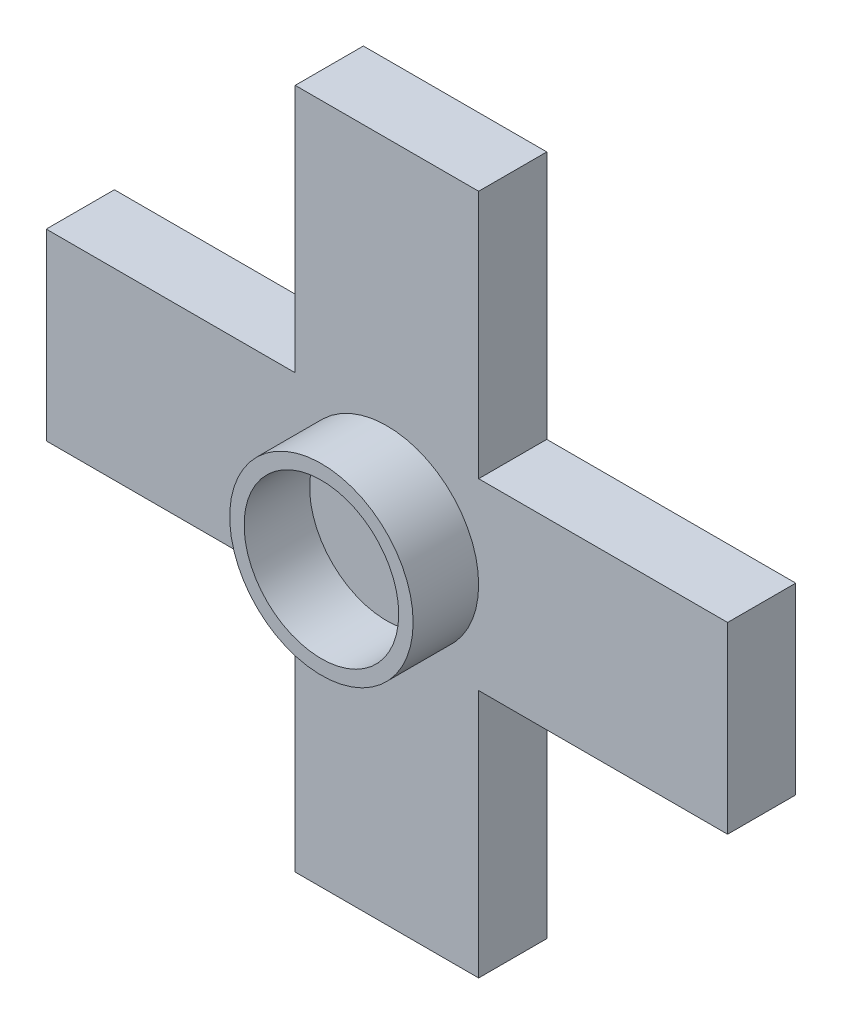
ISO-10303-21;
HEADER;
FILE_DESCRIPTION(('STEP AP214'),'2;1');
FILE_NAME('part.step','',(''),(''),'','','');
FILE_SCHEMA(('AUTOMOTIVE_DESIGN { 1 0 10303 214 1 1 1 1 }'));
ENDSEC;
DATA;
#1=APPLICATION_CONTEXT('core data for automotive mechanical design processes');
#2=APPLICATION_PROTOCOL_DEFINITION('international standard','automotive_design',2000,#1);
#3=PRODUCT_CONTEXT('',#1,'mechanical');
#4=PRODUCT('Part','Part','',(#3));
#5=PRODUCT_RELATED_PRODUCT_CATEGORY('part','',(#4));
#6=PRODUCT_DEFINITION_FORMATION('','',#4);
#7=PRODUCT_DEFINITION_CONTEXT('part definition',#1,'design');
#8=PRODUCT_DEFINITION('design','',#6,#7);
#9=PRODUCT_DEFINITION_SHAPE('','',#8);
#10=(LENGTH_UNIT() NAMED_UNIT(*) SI_UNIT(.MILLI.,.METRE.));
#11=(NAMED_UNIT(*) PLANE_ANGLE_UNIT() SI_UNIT($,.RADIAN.));
#12=(NAMED_UNIT(*) SI_UNIT($,.STERADIAN.) SOLID_ANGLE_UNIT());
#13=UNCERTAINTY_MEASURE_WITH_UNIT(LENGTH_MEASURE(1.E-05),#10,'distance_accuracy_value','');
#14=(GEOMETRIC_REPRESENTATION_CONTEXT(3) GLOBAL_UNCERTAINTY_ASSIGNED_CONTEXT((#13)) GLOBAL_UNIT_ASSIGNED_CONTEXT((#10,
#11,#12)) REPRESENTATION_CONTEXT('',''));
#15=CARTESIAN_POINT('',(0.,0.,0.));
#16=DIRECTION('',(0.,0.,1.));
#17=DIRECTION('',(1.,0.,0.));
#18=AXIS2_PLACEMENT_3D('',#15,#16,#17);
#19=CARTESIAN_POINT('',(11.2984237798552,0.0785714285714356,2.6));
#20=DIRECTION('',(1.,0.,0.));
#21=DIRECTION('',(0.,0.,-1.));
#22=AXIS2_PLACEMENT_3D('',#19,#20,#21);
#23=PLANE('',#22);
#24=DIRECTION('',(0.,-1.,0.));
#25=VECTOR('',#24,1.);
#26=CARTESIAN_POINT('',(11.2984237798552,0.0785714285714356,0.));
#27=LINE('',#26,#25);
#28=CARTESIAN_POINT('',(11.2984237798552,0.0785714285714356,0.));
#29=VERTEX_POINT('',#28);
#30=CARTESIAN_POINT('',(11.2984237798552,-6.92142857142856,0.));
#31=VERTEX_POINT('',#30);
#32=EDGE_CURVE('E154',#29,#31,#27,.T.);
#33=ORIENTED_EDGE('',*,*,#32,.T.);
#34=DIRECTION('',(0.,0.,-1.));
#35=VECTOR('',#34,1.);
#36=CARTESIAN_POINT('',(11.2984237798552,-6.92142857142856,2.6));
#37=LINE('',#36,#35);
#38=CARTESIAN_POINT('',(11.2984237798552,-6.92142857142856,2.6));
#39=VERTEX_POINT('',#38);
#40=EDGE_CURVE('E41',#39,#31,#37,.T.);
#41=ORIENTED_EDGE('',*,*,#40,.F.);
#42=DIRECTION('',(0.,-1.,0.));
#43=VECTOR('',#42,1.);
#44=CARTESIAN_POINT('',(11.2984237798552,0.0785714285714356,2.6));
#45=LINE('',#44,#43);
#46=CARTESIAN_POINT('',(11.2984237798552,0.0785714285714356,2.6));
#47=VERTEX_POINT('',#46);
#48=EDGE_CURVE('E177',#47,#39,#45,.T.);
#49=ORIENTED_EDGE('',*,*,#48,.F.);
#50=DIRECTION('',(0.,0.,-1.));
#51=VECTOR('',#50,1.);
#52=CARTESIAN_POINT('',(11.2984237798552,0.0785714285714356,2.6));
#53=LINE('',#52,#51);
#54=EDGE_CURVE('E150',#47,#29,#53,.T.);
#55=ORIENTED_EDGE('',*,*,#54,.T.);
#56=EDGE_LOOP('',(#33,#41,#49,#55));
#57=FACE_BOUND('',#56,.T.);
#58=ADVANCED_FACE('F33',(#57),#23,.F.);
#59=CARTESIAN_POINT('',(11.2984237798552,-6.92142857142856,2.6));
#60=DIRECTION('',(0.,1.,0.));
#61=DIRECTION('',(0.,0.,1.));
#62=AXIS2_PLACEMENT_3D('',#59,#60,#61);
#63=PLANE('',#62);
#64=DIRECTION('',(1.,0.,0.));
#65=VECTOR('',#64,1.);
#66=CARTESIAN_POINT('',(11.2984237798552,-6.92142857142856,0.));
#67=LINE('',#66,#65);
#68=CARTESIAN_POINT('',(20.7984237798552,-6.92142857142856,0.));
#69=VERTEX_POINT('',#68);
#70=EDGE_CURVE('E157',#31,#69,#67,.T.);
#71=ORIENTED_EDGE('',*,*,#70,.T.);
#72=DIRECTION('',(0.,0.,-1.));
#73=VECTOR('',#72,1.);
#74=CARTESIAN_POINT('',(20.7984237798552,-6.92142857142856,2.6));
#75=LINE('',#74,#73);
#76=CARTESIAN_POINT('',(20.7984237798552,-6.92142857142856,2.6));
#77=VERTEX_POINT('',#76);
#78=EDGE_CURVE('E199',#77,#69,#75,.T.);
#79=ORIENTED_EDGE('',*,*,#78,.F.);
#80=DIRECTION('',(1.,0.,0.));
#81=VECTOR('',#80,1.);
#82=CARTESIAN_POINT('',(11.2984237798552,-6.92142857142856,2.6));
#83=LINE('',#82,#81);
#84=EDGE_CURVE('E105',#39,#77,#83,.T.);
#85=ORIENTED_EDGE('',*,*,#84,.F.);
#86=ORIENTED_EDGE('',*,*,#40,.T.);
#87=EDGE_LOOP('',(#71,#79,#85,#86));
#88=FACE_BOUND('',#87,.T.);
#89=ADVANCED_FACE('F202',(#88),#63,.F.);
#90=CARTESIAN_POINT('',(20.7984237798552,-16.4214285714286,2.6));
#91=DIRECTION('',(1.,0.,0.));
#92=DIRECTION('',(0.,0.,-1.));
#93=AXIS2_PLACEMENT_3D('',#90,#91,#92);
#94=PLANE('',#93);
#95=DIRECTION('',(0.,-1.,0.));
#96=VECTOR('',#95,1.);
#97=CARTESIAN_POINT('',(20.7984237798552,-16.4214285714286,0.));
#98=LINE('',#97,#96);
#99=CARTESIAN_POINT('',(20.7984237798552,-16.4214285714286,0.));
#100=VERTEX_POINT('',#99);
#101=EDGE_CURVE('E160',#69,#100,#98,.T.);
#102=ORIENTED_EDGE('',*,*,#101,.T.);
#103=DIRECTION('',(0.,0.,-1.));
#104=VECTOR('',#103,1.);
#105=CARTESIAN_POINT('',(20.7984237798552,-16.4214285714286,2.6));
#106=LINE('',#105,#104);
#107=CARTESIAN_POINT('',(20.7984237798552,-16.4214285714286,2.6));
#108=VERTEX_POINT('',#107);
#109=EDGE_CURVE('E196',#108,#100,#106,.T.);
#110=ORIENTED_EDGE('',*,*,#109,.F.);
#111=DIRECTION('',(0.,-1.,0.));
#112=VECTOR('',#111,1.);
#113=CARTESIAN_POINT('',(20.7984237798552,-16.4214285714286,2.6));
#114=LINE('',#113,#112);
#115=EDGE_CURVE('E222',#77,#108,#114,.T.);
#116=ORIENTED_EDGE('',*,*,#115,.F.);
#117=ORIENTED_EDGE('',*,*,#78,.T.);
#118=EDGE_LOOP('',(#102,#110,#116,#117));
#119=FACE_BOUND('',#118,.T.);
#120=ADVANCED_FACE('F213',(#119),#94,.F.);
#121=CARTESIAN_POINT('',(20.7984237798552,-16.4214285714286,2.6));
#122=DIRECTION('',(0.,1.,0.));
#123=DIRECTION('',(0.,0.,1.));
#124=AXIS2_PLACEMENT_3D('',#121,#122,#123);
#125=PLANE('',#124);
#126=DIRECTION('',(1.,0.,0.));
#127=VECTOR('',#126,1.);
#128=CARTESIAN_POINT('',(20.7984237798552,-16.4214285714286,0.));
#129=LINE('',#128,#127);
#130=CARTESIAN_POINT('',(27.7984237798552,-16.4214285714286,0.));
#131=VERTEX_POINT('',#130);
#132=EDGE_CURVE('E162',#100,#131,#129,.T.);
#133=ORIENTED_EDGE('',*,*,#132,.T.);
#134=DIRECTION('',(0.,0.,-1.));
#135=VECTOR('',#134,1.);
#136=CARTESIAN_POINT('',(27.7984237798552,-16.4214285714286,2.6));
#137=LINE('',#136,#135);
#138=CARTESIAN_POINT('',(27.7984237798552,-16.4214285714286,2.6));
#139=VERTEX_POINT('',#138);
#140=EDGE_CURVE('E193',#139,#131,#137,.T.);
#141=ORIENTED_EDGE('',*,*,#140,.F.);
#142=DIRECTION('',(1.,0.,0.));
#143=VECTOR('',#142,1.);
#144=CARTESIAN_POINT('',(20.7984237798552,-16.4214285714286,2.6));
#145=LINE('',#144,#143);
#146=EDGE_CURVE('E219',#108,#139,#145,.T.);
#147=ORIENTED_EDGE('',*,*,#146,.F.);
#148=ORIENTED_EDGE('',*,*,#109,.T.);
#149=EDGE_LOOP('',(#133,#141,#147,#148));
#150=FACE_BOUND('',#149,.T.);
#151=ADVANCED_FACE('F217',(#150),#125,.F.);
#152=CARTESIAN_POINT('',(27.7984237798552,-16.4214285714286,2.6));
#153=DIRECTION('',(-1.,0.,0.));
#154=DIRECTION('',(0.,0.,1.));
#155=AXIS2_PLACEMENT_3D('',#152,#153,#154);
#156=PLANE('',#155);
#157=DIRECTION('',(0.,1.,0.));
#158=VECTOR('',#157,1.);
#159=CARTESIAN_POINT('',(27.7984237798552,-16.4214285714286,0.));
#160=LINE('',#159,#158);
#161=CARTESIAN_POINT('',(27.7984237798552,-6.92142857142856,0.));
#162=VERTEX_POINT('',#161);
#163=EDGE_CURVE('E164',#131,#162,#160,.T.);
#164=ORIENTED_EDGE('',*,*,#163,.T.);
#165=DIRECTION('',(0.,0.,-1.));
#166=VECTOR('',#165,1.);
#167=CARTESIAN_POINT('',(27.7984237798552,-6.92142857142856,2.6));
#168=LINE('',#167,#166);
#169=CARTESIAN_POINT('',(27.7984237798552,-6.92142857142856,2.6));
#170=VERTEX_POINT('',#169);
#171=EDGE_CURVE('E190',#170,#162,#168,.T.);
#172=ORIENTED_EDGE('',*,*,#171,.F.);
#173=DIRECTION('',(0.,1.,0.));
#174=VECTOR('',#173,1.);
#175=CARTESIAN_POINT('',(27.7984237798552,-16.4214285714286,2.6));
#176=LINE('',#175,#174);
#177=EDGE_CURVE('E221',#139,#170,#176,.T.);
#178=ORIENTED_EDGE('',*,*,#177,.F.);
#179=ORIENTED_EDGE('',*,*,#140,.T.);
#180=EDGE_LOOP('',(#164,#172,#178,#179));
#181=FACE_BOUND('',#180,.T.);
#182=ADVANCED_FACE('F253',(#181),#156,.F.);
#183=CARTESIAN_POINT('',(37.2984237798552,-6.92142857142856,2.6));
#184=DIRECTION('',(0.,1.,0.));
#185=DIRECTION('',(0.,0.,1.));
#186=AXIS2_PLACEMENT_3D('',#183,#184,#185);
#187=PLANE('',#186);
#188=DIRECTION('',(1.,0.,0.));
#189=VECTOR('',#188,1.);
#190=CARTESIAN_POINT('',(37.2984237798552,-6.92142857142856,0.));
#191=LINE('',#190,#189);
#192=CARTESIAN_POINT('',(37.2984237798552,-6.92142857142856,0.));
#193=VERTEX_POINT('',#192);
#194=EDGE_CURVE('E166',#162,#193,#191,.T.);
#195=ORIENTED_EDGE('',*,*,#194,.T.);
#196=DIRECTION('',(0.,0.,-1.));
#197=VECTOR('',#196,1.);
#198=CARTESIAN_POINT('',(37.2984237798552,-6.92142857142856,2.6));
#199=LINE('',#198,#197);
#200=CARTESIAN_POINT('',(37.2984237798552,-6.92142857142856,2.6));
#201=VERTEX_POINT('',#200);
#202=EDGE_CURVE('E187',#201,#193,#199,.T.);
#203=ORIENTED_EDGE('',*,*,#202,.F.);
#204=DIRECTION('',(1.,0.,0.));
#205=VECTOR('',#204,1.);
#206=CARTESIAN_POINT('',(37.2984237798552,-6.92142857142856,2.6));
#207=LINE('',#206,#205);
#208=EDGE_CURVE('E224',#170,#201,#207,.T.);
#209=ORIENTED_EDGE('',*,*,#208,.F.);
#210=ORIENTED_EDGE('',*,*,#171,.T.);
#211=EDGE_LOOP('',(#195,#203,#209,#210));
#212=FACE_BOUND('',#211,.T.);
#213=ADVANCED_FACE('F250',(#212),#187,.F.);
#214=CARTESIAN_POINT('',(37.2984237798552,0.0785714285714356,2.6));
#215=DIRECTION('',(-1.,0.,0.));
#216=DIRECTION('',(0.,-1.,0.));
#217=AXIS2_PLACEMENT_3D('',#214,#215,#216);
#218=PLANE('',#217);
#219=DIRECTION('',(0.,1.,0.));
#220=VECTOR('',#219,1.);
#221=CARTESIAN_POINT('',(37.2984237798552,0.0785714285714356,0.));
#222=LINE('',#221,#220);
#223=CARTESIAN_POINT('',(37.2984237798552,0.0785714285714356,0.));
#224=VERTEX_POINT('',#223);
#225=EDGE_CURVE('E168',#193,#224,#222,.T.);
#226=ORIENTED_EDGE('',*,*,#225,.T.);
#227=DIRECTION('',(0.,0.,-1.));
#228=VECTOR('',#227,1.);
#229=CARTESIAN_POINT('',(37.2984237798552,0.0785714285714356,2.6));
#230=LINE('',#229,#228);
#231=CARTESIAN_POINT('',(37.2984237798552,0.0785714285714356,2.6));
#232=VERTEX_POINT('',#231);
#233=EDGE_CURVE('E184',#232,#224,#230,.T.);
#234=ORIENTED_EDGE('',*,*,#233,.F.);
#235=DIRECTION('',(0.,1.,0.));
#236=VECTOR('',#235,1.);
#237=CARTESIAN_POINT('',(37.2984237798552,0.0785714285714356,2.6));
#238=LINE('',#237,#236);
#239=EDGE_CURVE('E230',#201,#232,#238,.T.);
#240=ORIENTED_EDGE('',*,*,#239,.F.);
#241=ORIENTED_EDGE('',*,*,#202,.T.);
#242=EDGE_LOOP('',(#226,#234,#240,#241));
#243=FACE_BOUND('',#242,.T.);
#244=ADVANCED_FACE('F246',(#243),#218,.F.);
#245=CARTESIAN_POINT('',(37.2984237798552,0.0785714285714356,2.6));
#246=DIRECTION('',(0.,-1.,0.));
#247=DIRECTION('',(0.,0.,-1.));
#248=AXIS2_PLACEMENT_3D('',#245,#246,#247);
#249=PLANE('',#248);
#250=DIRECTION('',(-1.,0.,0.));
#251=VECTOR('',#250,1.);
#252=CARTESIAN_POINT('',(37.2984237798552,0.0785714285714356,0.));
#253=LINE('',#252,#251);
#254=CARTESIAN_POINT('',(27.7984237798552,0.0785714285714356,0.));
#255=VERTEX_POINT('',#254);
#256=EDGE_CURVE('E170',#224,#255,#253,.T.);
#257=ORIENTED_EDGE('',*,*,#256,.T.);
#258=DIRECTION('',(0.,0.,-1.));
#259=VECTOR('',#258,1.);
#260=CARTESIAN_POINT('',(27.7984237798552,0.0785714285714356,2.6));
#261=LINE('',#260,#259);
#262=CARTESIAN_POINT('',(27.7984237798552,0.0785714285714356,2.6));
#263=VERTEX_POINT('',#262);
#264=EDGE_CURVE('E181',#263,#255,#261,.T.);
#265=ORIENTED_EDGE('',*,*,#264,.F.);
#266=DIRECTION('',(-1.,0.,0.));
#267=VECTOR('',#266,1.);
#268=CARTESIAN_POINT('',(37.2984237798552,0.0785714285714356,2.6));
#269=LINE('',#268,#267);
#270=EDGE_CURVE('E232',#232,#263,#269,.T.);
#271=ORIENTED_EDGE('',*,*,#270,.F.);
#272=ORIENTED_EDGE('',*,*,#233,.T.);
#273=EDGE_LOOP('',(#257,#265,#271,#272));
#274=FACE_BOUND('',#273,.T.);
#275=ADVANCED_FACE('F238',(#274),#249,.F.);
#276=CARTESIAN_POINT('',(27.7984237798552,9.57857142857143,2.6));
#277=DIRECTION('',(-1.,0.,0.));
#278=DIRECTION('',(0.,0.,1.));
#279=AXIS2_PLACEMENT_3D('',#276,#277,#278);
#280=PLANE('',#279);
#281=DIRECTION('',(0.,1.,0.));
#282=VECTOR('',#281,1.);
#283=CARTESIAN_POINT('',(27.7984237798552,9.57857142857143,0.));
#284=LINE('',#283,#282);
#285=CARTESIAN_POINT('',(27.7984237798552,9.57857142857143,0.));
#286=VERTEX_POINT('',#285);
#287=EDGE_CURVE('E172',#255,#286,#284,.T.);
#288=ORIENTED_EDGE('',*,*,#287,.T.);
#289=DIRECTION('',(0.,0.,-1.));
#290=VECTOR('',#289,1.);
#291=CARTESIAN_POINT('',(27.7984237798552,9.57857142857143,2.6));
#292=LINE('',#291,#290);
#293=CARTESIAN_POINT('',(27.7984237798552,9.57857142857143,2.6));
#294=VERTEX_POINT('',#293);
#295=EDGE_CURVE('E145',#294,#286,#292,.T.);
#296=ORIENTED_EDGE('',*,*,#295,.F.);
#297=DIRECTION('',(0.,1.,0.));
#298=VECTOR('',#297,1.);
#299=CARTESIAN_POINT('',(27.7984237798552,9.57857142857143,2.6));
#300=LINE('',#299,#298);
#301=EDGE_CURVE('E136',#263,#294,#300,.T.);
#302=ORIENTED_EDGE('',*,*,#301,.F.);
#303=ORIENTED_EDGE('',*,*,#264,.T.);
#304=EDGE_LOOP('',(#288,#296,#302,#303));
#305=FACE_BOUND('',#304,.T.);
#306=ADVANCED_FACE('F242',(#305),#280,.F.);
#307=CARTESIAN_POINT('',(20.7984237798552,9.57857142857143,2.6));
#308=DIRECTION('',(0.,-1.,0.));
#309=DIRECTION('',(0.,0.,-1.));
#310=AXIS2_PLACEMENT_3D('',#307,#308,#309);
#311=PLANE('',#310);
#312=DIRECTION('',(-1.,0.,0.));
#313=VECTOR('',#312,1.);
#314=CARTESIAN_POINT('',(20.7984237798552,9.57857142857143,0.));
#315=LINE('',#314,#313);
#316=CARTESIAN_POINT('',(20.7984237798552,9.57857142857143,0.));
#317=VERTEX_POINT('',#316);
#318=EDGE_CURVE('E144',#286,#317,#315,.T.);
#319=ORIENTED_EDGE('',*,*,#318,.T.);
#320=DIRECTION('',(0.,0.,-1.));
#321=VECTOR('',#320,1.);
#322=CARTESIAN_POINT('',(20.7984237798552,9.57857142857143,2.6));
#323=LINE('',#322,#321);
#324=CARTESIAN_POINT('',(20.7984237798552,9.57857142857143,2.6));
#325=VERTEX_POINT('',#324);
#326=EDGE_CURVE('E141',#325,#317,#323,.T.);
#327=ORIENTED_EDGE('',*,*,#326,.F.);
#328=DIRECTION('',(-1.,0.,0.));
#329=VECTOR('',#328,1.);
#330=CARTESIAN_POINT('',(20.7984237798552,9.57857142857143,2.6));
#331=LINE('',#330,#329);
#332=EDGE_CURVE('E130',#294,#325,#331,.T.);
#333=ORIENTED_EDGE('',*,*,#332,.F.);
#334=ORIENTED_EDGE('',*,*,#295,.T.);
#335=EDGE_LOOP('',(#319,#327,#333,#334));
#336=FACE_BOUND('',#335,.T.);
#337=ADVANCED_FACE('F142',(#336),#311,.F.);
#338=CARTESIAN_POINT('',(20.7984237798552,9.57857142857143,2.6));
#339=DIRECTION('',(1.,0.,0.));
#340=DIRECTION('',(0.,0.,-1.));
#341=AXIS2_PLACEMENT_3D('',#338,#339,#340);
#342=PLANE('',#341);
#343=DIRECTION('',(0.,-1.,0.));
#344=VECTOR('',#343,1.);
#345=CARTESIAN_POINT('',(20.7984237798552,9.57857142857143,0.));
#346=LINE('',#345,#344);
#347=CARTESIAN_POINT('',(20.7984237798552,0.0785714285714356,0.));
#348=VERTEX_POINT('',#347);
#349=EDGE_CURVE('E90',#317,#348,#346,.T.);
#350=ORIENTED_EDGE('',*,*,#349,.T.);
#351=DIRECTION('',(0.,0.,-1.));
#352=VECTOR('',#351,1.);
#353=CARTESIAN_POINT('',(20.7984237798552,0.0785714285714356,2.6));
#354=LINE('',#353,#352);
#355=CARTESIAN_POINT('',(20.7984237798552,0.0785714285714356,2.6));
#356=VERTEX_POINT('',#355);
#357=EDGE_CURVE('E146',#356,#348,#354,.T.);
#358=ORIENTED_EDGE('',*,*,#357,.F.);
#359=DIRECTION('',(0.,-1.,0.));
#360=VECTOR('',#359,1.);
#361=CARTESIAN_POINT('',(20.7984237798552,9.57857142857143,2.6));
#362=LINE('',#361,#360);
#363=EDGE_CURVE('E134',#325,#356,#362,.T.);
#364=ORIENTED_EDGE('',*,*,#363,.F.);
#365=ORIENTED_EDGE('',*,*,#326,.T.);
#366=EDGE_LOOP('',(#350,#358,#364,#365));
#367=FACE_BOUND('',#366,.T.);
#368=ADVANCED_FACE('F148',(#367),#342,.F.);
#369=CARTESIAN_POINT('',(11.2984237798552,0.0785714285714356,2.6));
#370=DIRECTION('',(0.,-1.,0.));
#371=DIRECTION('',(0.,0.,-1.));
#372=AXIS2_PLACEMENT_3D('',#369,#370,#371);
#373=PLANE('',#372);
#374=DIRECTION('',(-1.,0.,0.));
#375=VECTOR('',#374,1.);
#376=CARTESIAN_POINT('',(11.2984237798552,0.0785714285714356,0.));
#377=LINE('',#376,#375);
#378=EDGE_CURVE('E96',#348,#29,#377,.T.);
#379=ORIENTED_EDGE('',*,*,#378,.T.);
#380=ORIENTED_EDGE('',*,*,#54,.F.);
#381=DIRECTION('',(-1.,0.,0.));
#382=VECTOR('',#381,1.);
#383=CARTESIAN_POINT('',(11.2984237798552,0.0785714285714356,2.6));
#384=LINE('',#383,#382);
#385=EDGE_CURVE('E49',#356,#47,#384,.T.);
#386=ORIENTED_EDGE('',*,*,#385,.F.);
#387=ORIENTED_EDGE('',*,*,#357,.T.);
#388=EDGE_LOOP('',(#379,#380,#386,#387));
#389=FACE_BOUND('',#388,.T.);
#390=ADVANCED_FACE('F327',(#389),#373,.F.);
#391=CARTESIAN_POINT('',(0.,0.,2.6));
#392=DIRECTION('',(0.,0.,1.));
#393=DIRECTION('',(1.,0.,0.));
#394=AXIS2_PLACEMENT_3D('',#391,#392,#393);
#395=PLANE('',#394);
#396=CARTESIAN_POINT('',(24.2984237798552,-3.42142857142856,2.6));
#397=DIRECTION('',(0.,0.,1.));
#398=DIRECTION('',(1.,0.,0.));
#399=AXIS2_PLACEMENT_3D('',#396,#397,#398);
#400=CIRCLE('',#399,3.5);
#401=CARTESIAN_POINT('',(27.7984237798552,-3.42142857142856,2.6));
#402=VERTEX_POINT('',#401);
#403=EDGE_CURVE('E401',#402,#402,#400,.T.);
#404=ORIENTED_EDGE('',*,*,#403,.F.);
#405=EDGE_LOOP('',(#404));
#406=FACE_BOUND('',#405,.T.);
#407=ORIENTED_EDGE('',*,*,#48,.T.);
#408=ORIENTED_EDGE('',*,*,#84,.T.);
#409=ORIENTED_EDGE('',*,*,#115,.T.);
#410=ORIENTED_EDGE('',*,*,#146,.T.);
#411=ORIENTED_EDGE('',*,*,#177,.T.);
#412=ORIENTED_EDGE('',*,*,#208,.T.);
#413=ORIENTED_EDGE('',*,*,#239,.T.);
#414=ORIENTED_EDGE('',*,*,#270,.T.);
#415=ORIENTED_EDGE('',*,*,#301,.T.);
#416=ORIENTED_EDGE('',*,*,#332,.T.);
#417=ORIENTED_EDGE('',*,*,#363,.T.);
#418=ORIENTED_EDGE('',*,*,#385,.T.);
#419=EDGE_LOOP('',(#407,#408,#409,#410,#411,#412,#413,#414,#415,#416,#417,#418));
#420=FACE_BOUND('',#419,.T.);
#421=ADVANCED_FACE('F132',(#406,#420),#395,.T.);
#422=CARTESIAN_POINT('',(0.,0.,0.));
#423=DIRECTION('',(0.,0.,1.));
#424=DIRECTION('',(1.,0.,0.));
#425=AXIS2_PLACEMENT_3D('',#422,#423,#424);
#426=PLANE('',#425);
#427=ORIENTED_EDGE('',*,*,#32,.F.);
#428=ORIENTED_EDGE('',*,*,#378,.F.);
#429=ORIENTED_EDGE('',*,*,#349,.F.);
#430=ORIENTED_EDGE('',*,*,#318,.F.);
#431=ORIENTED_EDGE('',*,*,#287,.F.);
#432=ORIENTED_EDGE('',*,*,#256,.F.);
#433=ORIENTED_EDGE('',*,*,#225,.F.);
#434=ORIENTED_EDGE('',*,*,#194,.F.);
#435=ORIENTED_EDGE('',*,*,#163,.F.);
#436=ORIENTED_EDGE('',*,*,#132,.F.);
#437=ORIENTED_EDGE('',*,*,#101,.F.);
#438=ORIENTED_EDGE('',*,*,#70,.F.);
#439=EDGE_LOOP('',(#427,#428,#429,#430,#431,#432,#433,#434,#435,#436,#437,#438));
#440=FACE_BOUND('',#439,.T.);
#441=ADVANCED_FACE('F207',(#440),#426,.F.);
#442=CARTESIAN_POINT('',(24.2984237798552,-3.42142857142856,5.1));
#443=DIRECTION('',(0.,0.,1.));
#444=DIRECTION('',(1.,0.,0.));
#445=AXIS2_PLACEMENT_3D('',#442,#443,#444);
#446=PLANE('',#445);
#447=CARTESIAN_POINT('',(24.2984237798552,-3.42142857142856,5.1));
#448=DIRECTION('',(0.,0.,1.));
#449=DIRECTION('',(1.,0.,0.));
#450=AXIS2_PLACEMENT_3D('',#447,#448,#449);
#451=CIRCLE('',#450,3.5);
#452=CARTESIAN_POINT('',(27.7984237798552,-3.42142857142856,5.1));
#453=VERTEX_POINT('',#452);
#454=EDGE_CURVE('E158',#453,#453,#451,.T.);
#455=ORIENTED_EDGE('',*,*,#454,.T.);
#456=EDGE_LOOP('',(#455));
#457=FACE_BOUND('',#456,.T.);
#458=CARTESIAN_POINT('',(24.2984237798552,-3.42142857142856,5.1));
#459=DIRECTION('',(0.,0.,1.));
#460=DIRECTION('',(1.,0.,0.));
#461=AXIS2_PLACEMENT_3D('',#458,#459,#460);
#462=CIRCLE('',#461,2.95);
#463=CARTESIAN_POINT('',(27.2484237798552,-3.42142857142856,5.1));
#464=VERTEX_POINT('',#463);
#465=EDGE_CURVE('E399',#464,#464,#462,.T.);
#466=ORIENTED_EDGE('',*,*,#465,.F.);
#467=EDGE_LOOP('',(#466));
#468=FACE_BOUND('',#467,.T.);
#469=ADVANCED_FACE('F346',(#457,#468),#446,.T.);
#470=CARTESIAN_POINT('',(24.2984237798552,-3.42142857142856,5.1));
#471=DIRECTION('',(0.,0.,-1.));
#472=DIRECTION('',(-1.,0.,0.));
#473=AXIS2_PLACEMENT_3D('',#470,#471,#472);
#474=CYLINDRICAL_SURFACE('',#473,3.5);
#475=ORIENTED_EDGE('',*,*,#454,.F.);
#476=EDGE_LOOP('',(#475));
#477=FACE_BOUND('',#476,.T.);
#478=ORIENTED_EDGE('',*,*,#403,.T.);
#479=EDGE_LOOP('',(#478));
#480=FACE_BOUND('',#479,.T.);
#481=ADVANCED_FACE('F364',(#477,#480),#474,.T.);
#482=CARTESIAN_POINT('',(24.2984237798552,-3.42142857142856,5.1));
#483=DIRECTION('',(0.,0.,-1.));
#484=DIRECTION('',(-1.,0.,0.));
#485=AXIS2_PLACEMENT_3D('',#482,#483,#484);
#486=CYLINDRICAL_SURFACE('',#485,2.95);
#487=ORIENTED_EDGE('',*,*,#465,.T.);
#488=EDGE_LOOP('',(#487));
#489=FACE_BOUND('',#488,.T.);
#490=CARTESIAN_POINT('',(24.2984237798552,-3.42142857142856,2.6));
#491=DIRECTION('',(0.,0.,1.));
#492=DIRECTION('',(1.,0.,0.));
#493=AXIS2_PLACEMENT_3D('',#490,#491,#492);
#494=CIRCLE('',#493,2.95);
#495=CARTESIAN_POINT('',(27.2484237798552,-3.42142857142856,2.6));
#496=VERTEX_POINT('',#495);
#497=EDGE_CURVE('E11',#496,#496,#494,.F.);
#498=ORIENTED_EDGE('',*,*,#497,.T.);
#499=EDGE_LOOP('',(#498));
#500=FACE_BOUND('',#499,.T.);
#501=ADVANCED_FACE('F374',(#489,#500),#486,.F.);
#502=ORIENTED_EDGE('',*,*,#497,.F.);
#503=EDGE_LOOP('',(#502));
#504=FACE_BOUND('',#503,.T.);
#505=ADVANCED_FACE('F357',(#504),#395,.T.);
#506=CLOSED_SHELL('',(#58,#89,#120,#151,#182,#213,#244,#275,#306,#337,#368,#390,#421,#441,#469,
#481,#501,#505));
#507=MANIFOLD_SOLID_BREP('B2',#506);
#508=ADVANCED_BREP_SHAPE_REPRESENTATION('',(#18,#507),#14);
#509=SHAPE_DEFINITION_REPRESENTATION(#9,#508);
ENDSEC;
END-ISO-10303-21;
